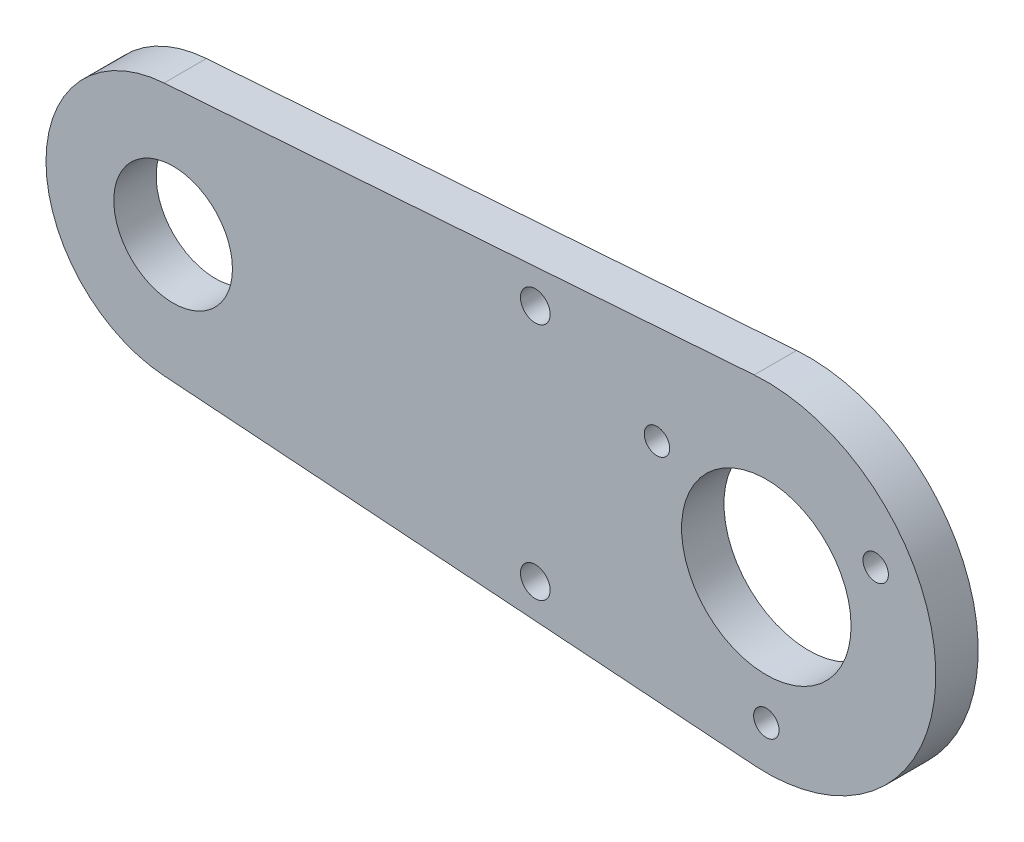
ISO-10303-21;
HEADER;
FILE_DESCRIPTION(('STEP AP214'),'2;1');
FILE_NAME('part.step','',(''),(''),'','','');
FILE_SCHEMA(('AUTOMOTIVE_DESIGN { 1 0 10303 214 1 1 1 1 }'));
ENDSEC;
DATA;
#1=APPLICATION_CONTEXT('core data for automotive mechanical design processes');
#2=APPLICATION_PROTOCOL_DEFINITION('international standard','automotive_design',2000,#1);
#3=PRODUCT_CONTEXT('',#1,'mechanical');
#4=PRODUCT('Part','Part','',(#3));
#5=PRODUCT_RELATED_PRODUCT_CATEGORY('part','',(#4));
#6=PRODUCT_DEFINITION_FORMATION('','',#4);
#7=PRODUCT_DEFINITION_CONTEXT('part definition',#1,'design');
#8=PRODUCT_DEFINITION('design','',#6,#7);
#9=PRODUCT_DEFINITION_SHAPE('','',#8);
#10=(LENGTH_UNIT() NAMED_UNIT(*) SI_UNIT(.MILLI.,.METRE.));
#11=(NAMED_UNIT(*) PLANE_ANGLE_UNIT() SI_UNIT($,.RADIAN.));
#12=(NAMED_UNIT(*) SI_UNIT($,.STERADIAN.) SOLID_ANGLE_UNIT());
#13=UNCERTAINTY_MEASURE_WITH_UNIT(LENGTH_MEASURE(1.E-05),#10,'distance_accuracy_value','');
#14=(GEOMETRIC_REPRESENTATION_CONTEXT(3) GLOBAL_UNCERTAINTY_ASSIGNED_CONTEXT((#13)) GLOBAL_UNIT_ASSIGNED_CONTEXT((#10,
#11,#12)) REPRESENTATION_CONTEXT('',''));
#15=CARTESIAN_POINT('',(0.,0.,0.));
#16=DIRECTION('',(0.,0.,1.));
#17=DIRECTION('',(1.,0.,0.));
#18=AXIS2_PLACEMENT_3D('',#15,#16,#17);
#19=CARTESIAN_POINT('',(0.,0.,5.));
#20=DIRECTION('',(0.,0.,1.));
#21=DIRECTION('',(1.,0.,0.));
#22=AXIS2_PLACEMENT_3D('',#19,#20,#21);
#23=PLANE('',#22);
#24=CARTESIAN_POINT('',(-27.2623215608162,14.0886777814287,5.));
#25=DIRECTION('',(0.,0.,1.));
#26=DIRECTION('',(1.,0.,0.));
#27=AXIS2_PLACEMENT_3D('',#24,#25,#26);
#28=CIRCLE('',#27,1.75);
#29=CARTESIAN_POINT('',(-25.5123215608162,14.0886777814287,5.));
#30=VERTEX_POINT('',#29);
#31=EDGE_CURVE('E141',#30,#30,#28,.T.);
#32=ORIENTED_EDGE('',*,*,#31,.F.);
#33=EDGE_LOOP('',(#32));
#34=FACE_BOUND('',#33,.T.);
#35=CARTESIAN_POINT('',(0.,-14.9000000000001,5.));
#36=DIRECTION('',(0.,0.,1.));
#37=DIRECTION('',(1.,0.,0.));
#38=AXIS2_PLACEMENT_3D('',#35,#36,#37);
#39=CIRCLE('',#38,1.5);
#40=CARTESIAN_POINT('',(1.5,-14.9000000000001,5.));
#41=VERTEX_POINT('',#40);
#42=EDGE_CURVE('E129',#41,#41,#39,.T.);
#43=ORIENTED_EDGE('',*,*,#42,.F.);
#44=EDGE_LOOP('',(#43));
#45=FACE_BOUND('',#44,.T.);
#46=CARTESIAN_POINT('',(-70.,0.,5.));
#47=DIRECTION('',(0.,0.,1.));
#48=DIRECTION('',(1.,0.,0.));
#49=AXIS2_PLACEMENT_3D('',#46,#47,#48);
#50=CIRCLE('',#49,7.);
#51=CARTESIAN_POINT('',(-63.,0.,5.));
#52=VERTEX_POINT('',#51);
#53=EDGE_CURVE('E117',#52,#52,#50,.T.);
#54=ORIENTED_EDGE('',*,*,#53,.F.);
#55=EDGE_LOOP('',(#54));
#56=FACE_BOUND('',#55,.T.);
#57=CARTESIAN_POINT('',(0.,0.,5.));
#58=DIRECTION('',(0.,0.,1.));
#59=DIRECTION('',(1.,0.,0.));
#60=AXIS2_PLACEMENT_3D('',#57,#58,#59);
#61=CIRCLE('',#60,20.);
#62=CARTESIAN_POINT('',(-1.42857142857143,-19.9489143482413,5.));
#63=VERTEX_POINT('',#62);
#64=CARTESIAN_POINT('',(-1.42857142857143,19.9489143482413,5.));
#65=VERTEX_POINT('',#64);
#66=EDGE_CURVE('E87',#63,#65,#61,.T.);
#67=ORIENTED_EDGE('',*,*,#66,.T.);
#68=DIRECTION('',(-0.997445717412067,-0.0714285714285714,0.));
#69=VECTOR('',#68,1.);
#70=CARTESIAN_POINT('',(-71.0714285714286,14.961685761181,5.));
#71=LINE('',#70,#69);
#72=CARTESIAN_POINT('',(-71.0714285714286,14.961685761181,5.));
#73=VERTEX_POINT('',#72);
#74=EDGE_CURVE('E82',#65,#73,#71,.T.);
#75=ORIENTED_EDGE('',*,*,#74,.T.);
#76=CARTESIAN_POINT('',(-70.,0.,5.));
#77=DIRECTION('',(0.,0.,1.));
#78=DIRECTION('',(-1.,0.,0.));
#79=AXIS2_PLACEMENT_3D('',#76,#77,#78);
#80=CIRCLE('',#79,15.);
#81=CARTESIAN_POINT('',(-71.0714285714286,-14.961685761181,5.));
#82=VERTEX_POINT('',#81);
#83=EDGE_CURVE('E85',#73,#82,#80,.T.);
#84=ORIENTED_EDGE('',*,*,#83,.T.);
#85=DIRECTION('',(0.997445717412067,-0.0714285714285714,0.));
#86=VECTOR('',#85,1.);
#87=CARTESIAN_POINT('',(-71.0714285714286,-14.961685761181,5.));
#88=LINE('',#87,#86);
#89=EDGE_CURVE('E52',#82,#63,#88,.T.);
#90=ORIENTED_EDGE('',*,*,#89,.T.);
#91=EDGE_LOOP('',(#67,#75,#84,#90));
#92=FACE_BOUND('',#91,.T.);
#93=CARTESIAN_POINT('',(0.,0.,5.));
#94=DIRECTION('',(0.,0.,1.));
#95=DIRECTION('',(1.,0.,0.));
#96=AXIS2_PLACEMENT_3D('',#93,#94,#95);
#97=CIRCLE('',#96,10.);
#98=CARTESIAN_POINT('',(10.,0.,5.));
#99=VERTEX_POINT('',#98);
#100=EDGE_CURVE('E102',#99,#99,#97,.T.);
#101=ORIENTED_EDGE('',*,*,#100,.F.);
#102=EDGE_LOOP('',(#101));
#103=FACE_BOUND('',#102,.T.);
#104=CARTESIAN_POINT('',(-12.9037785163881,7.45,5.));
#105=DIRECTION('',(0.,0.,1.));
#106=DIRECTION('',(1.,0.,0.));
#107=AXIS2_PLACEMENT_3D('',#104,#105,#106);
#108=CIRCLE('',#107,1.5);
#109=CARTESIAN_POINT('',(-11.4037785163881,7.45,5.));
#110=VERTEX_POINT('',#109);
#111=EDGE_CURVE('E123',#110,#110,#108,.T.);
#112=ORIENTED_EDGE('',*,*,#111,.F.);
#113=EDGE_LOOP('',(#112));
#114=FACE_BOUND('',#113,.T.);
#115=CARTESIAN_POINT('',(12.9037785163882,7.44999999999981,5.));
#116=DIRECTION('',(0.,0.,1.));
#117=DIRECTION('',(1.,0.,0.));
#118=AXIS2_PLACEMENT_3D('',#115,#116,#117);
#119=CIRCLE('',#118,1.5);
#120=CARTESIAN_POINT('',(14.4037785163882,7.44999999999981,5.));
#121=VERTEX_POINT('',#120);
#122=EDGE_CURVE('E135',#121,#121,#119,.T.);
#123=ORIENTED_EDGE('',*,*,#122,.F.);
#124=EDGE_LOOP('',(#123));
#125=FACE_BOUND('',#124,.T.);
#126=CARTESIAN_POINT('',(-27.2623215608162,-14.0886777814287,5.));
#127=DIRECTION('',(0.,0.,1.));
#128=DIRECTION('',(1.,0.,0.));
#129=AXIS2_PLACEMENT_3D('',#126,#127,#128);
#130=CIRCLE('',#129,1.75);
#131=CARTESIAN_POINT('',(-25.5123215608162,-14.0886777814287,5.));
#132=VERTEX_POINT('',#131);
#133=EDGE_CURVE('E147',#132,#132,#130,.T.);
#134=ORIENTED_EDGE('',*,*,#133,.F.);
#135=EDGE_LOOP('',(#134));
#136=FACE_BOUND('',#135,.T.);
#137=ADVANCED_FACE('F35',(#34,#45,#56,#92,#103,#114,#125,#136),#23,.T.);
#138=CARTESIAN_POINT('',(0.,0.,0.));
#139=DIRECTION('',(0.,0.,1.));
#140=DIRECTION('',(1.,0.,0.));
#141=AXIS2_PLACEMENT_3D('',#138,#139,#140);
#142=PLANE('',#141);
#143=CARTESIAN_POINT('',(0.,0.,0.));
#144=DIRECTION('',(0.,0.,1.));
#145=DIRECTION('',(1.,0.,0.));
#146=AXIS2_PLACEMENT_3D('',#143,#144,#145);
#147=CIRCLE('',#146,20.);
#148=CARTESIAN_POINT('',(-1.42857142857143,-19.9489143482413,0.));
#149=VERTEX_POINT('',#148);
#150=CARTESIAN_POINT('',(-1.42857142857143,19.9489143482413,0.));
#151=VERTEX_POINT('',#150);
#152=EDGE_CURVE('E99',#149,#151,#147,.T.);
#153=ORIENTED_EDGE('',*,*,#152,.F.);
#154=DIRECTION('',(0.997445717412067,-0.0714285714285714,0.));
#155=VECTOR('',#154,1.);
#156=CARTESIAN_POINT('',(-71.0714285714286,-14.961685761181,0.));
#157=LINE('',#156,#155);
#158=CARTESIAN_POINT('',(-71.0714285714286,-14.961685761181,0.));
#159=VERTEX_POINT('',#158);
#160=EDGE_CURVE('E75',#159,#149,#157,.T.);
#161=ORIENTED_EDGE('',*,*,#160,.F.);
#162=CARTESIAN_POINT('',(-70.,0.,0.));
#163=DIRECTION('',(0.,0.,1.));
#164=DIRECTION('',(-1.,0.,0.));
#165=AXIS2_PLACEMENT_3D('',#162,#163,#164);
#166=CIRCLE('',#165,15.);
#167=CARTESIAN_POINT('',(-71.0714285714286,14.961685761181,0.));
#168=VERTEX_POINT('',#167);
#169=EDGE_CURVE('E69',#168,#159,#166,.T.);
#170=ORIENTED_EDGE('',*,*,#169,.F.);
#171=DIRECTION('',(-0.997445717412067,-0.0714285714285714,0.));
#172=VECTOR('',#171,1.);
#173=CARTESIAN_POINT('',(-71.0714285714286,14.961685761181,0.));
#174=LINE('',#173,#172);
#175=EDGE_CURVE('E91',#151,#168,#174,.T.);
#176=ORIENTED_EDGE('',*,*,#175,.F.);
#177=EDGE_LOOP('',(#153,#161,#170,#176));
#178=FACE_BOUND('',#177,.T.);
#179=CARTESIAN_POINT('',(0.,0.,0.));
#180=DIRECTION('',(0.,0.,1.));
#181=DIRECTION('',(1.,0.,0.));
#182=AXIS2_PLACEMENT_3D('',#179,#180,#181);
#183=CIRCLE('',#182,10.);
#184=CARTESIAN_POINT('',(10.,0.,0.));
#185=VERTEX_POINT('',#184);
#186=EDGE_CURVE('E114',#185,#185,#183,.T.);
#187=ORIENTED_EDGE('',*,*,#186,.T.);
#188=EDGE_LOOP('',(#187));
#189=FACE_BOUND('',#188,.T.);
#190=CARTESIAN_POINT('',(-70.,0.,0.));
#191=DIRECTION('',(0.,0.,1.));
#192=DIRECTION('',(1.,0.,0.));
#193=AXIS2_PLACEMENT_3D('',#190,#191,#192);
#194=CIRCLE('',#193,7.);
#195=CARTESIAN_POINT('',(-63.,0.,0.));
#196=VERTEX_POINT('',#195);
#197=EDGE_CURVE('E120',#196,#196,#194,.T.);
#198=ORIENTED_EDGE('',*,*,#197,.T.);
#199=EDGE_LOOP('',(#198));
#200=FACE_BOUND('',#199,.T.);
#201=CARTESIAN_POINT('',(-12.9037785163881,7.45,0.));
#202=DIRECTION('',(0.,0.,1.));
#203=DIRECTION('',(1.,0.,0.));
#204=AXIS2_PLACEMENT_3D('',#201,#202,#203);
#205=CIRCLE('',#204,1.5);
#206=CARTESIAN_POINT('',(-11.4037785163881,7.45,0.));
#207=VERTEX_POINT('',#206);
#208=EDGE_CURVE('E126',#207,#207,#205,.T.);
#209=ORIENTED_EDGE('',*,*,#208,.T.);
#210=EDGE_LOOP('',(#209));
#211=FACE_BOUND('',#210,.T.);
#212=CARTESIAN_POINT('',(0.,-14.9000000000001,0.));
#213=DIRECTION('',(0.,0.,1.));
#214=DIRECTION('',(1.,0.,0.));
#215=AXIS2_PLACEMENT_3D('',#212,#213,#214);
#216=CIRCLE('',#215,1.5);
#217=CARTESIAN_POINT('',(1.5,-14.9000000000001,0.));
#218=VERTEX_POINT('',#217);
#219=EDGE_CURVE('E132',#218,#218,#216,.T.);
#220=ORIENTED_EDGE('',*,*,#219,.T.);
#221=EDGE_LOOP('',(#220));
#222=FACE_BOUND('',#221,.T.);
#223=CARTESIAN_POINT('',(12.9037785163882,7.44999999999981,0.));
#224=DIRECTION('',(0.,0.,1.));
#225=DIRECTION('',(1.,0.,0.));
#226=AXIS2_PLACEMENT_3D('',#223,#224,#225);
#227=CIRCLE('',#226,1.5);
#228=CARTESIAN_POINT('',(14.4037785163882,7.44999999999981,0.));
#229=VERTEX_POINT('',#228);
#230=EDGE_CURVE('E138',#229,#229,#227,.T.);
#231=ORIENTED_EDGE('',*,*,#230,.T.);
#232=EDGE_LOOP('',(#231));
#233=FACE_BOUND('',#232,.T.);
#234=CARTESIAN_POINT('',(-27.2623215608162,14.0886777814287,0.));
#235=DIRECTION('',(0.,0.,1.));
#236=DIRECTION('',(1.,0.,0.));
#237=AXIS2_PLACEMENT_3D('',#234,#235,#236);
#238=CIRCLE('',#237,1.75);
#239=CARTESIAN_POINT('',(-25.5123215608162,14.0886777814287,0.));
#240=VERTEX_POINT('',#239);
#241=EDGE_CURVE('E144',#240,#240,#238,.T.);
#242=ORIENTED_EDGE('',*,*,#241,.T.);
#243=EDGE_LOOP('',(#242));
#244=FACE_BOUND('',#243,.T.);
#245=CARTESIAN_POINT('',(-27.2623215608162,-14.0886777814287,0.));
#246=DIRECTION('',(0.,0.,1.));
#247=DIRECTION('',(1.,0.,0.));
#248=AXIS2_PLACEMENT_3D('',#245,#246,#247);
#249=CIRCLE('',#248,1.75);
#250=CARTESIAN_POINT('',(-25.5123215608162,-14.0886777814287,0.));
#251=VERTEX_POINT('',#250);
#252=EDGE_CURVE('E150',#251,#251,#249,.T.);
#253=ORIENTED_EDGE('',*,*,#252,.T.);
#254=EDGE_LOOP('',(#253));
#255=FACE_BOUND('',#254,.T.);
#256=ADVANCED_FACE('F110',(#178,#189,#200,#211,#222,#233,#244,#255),#142,.F.);
#257=CARTESIAN_POINT('',(0.,0.,5.));
#258=DIRECTION('',(0.,0.,-1.));
#259=DIRECTION('',(-1.,0.,0.));
#260=AXIS2_PLACEMENT_3D('',#257,#258,#259);
#261=CYLINDRICAL_SURFACE('',#260,20.);
#262=ORIENTED_EDGE('',*,*,#152,.T.);
#263=DIRECTION('',(0.,0.,-1.));
#264=VECTOR('',#263,1.);
#265=CARTESIAN_POINT('',(-1.42857142857143,19.9489143482413,5.));
#266=LINE('',#265,#264);
#267=EDGE_CURVE('E11',#65,#151,#266,.T.);
#268=ORIENTED_EDGE('',*,*,#267,.F.);
#269=ORIENTED_EDGE('',*,*,#66,.F.);
#270=DIRECTION('',(0.,0.,-1.));
#271=VECTOR('',#270,1.);
#272=CARTESIAN_POINT('',(-1.42857142857143,-19.9489143482413,5.));
#273=LINE('',#272,#271);
#274=EDGE_CURVE('E95',#63,#149,#273,.T.);
#275=ORIENTED_EDGE('',*,*,#274,.T.);
#276=EDGE_LOOP('',(#262,#268,#269,#275));
#277=FACE_BOUND('',#276,.T.);
#278=ADVANCED_FACE('F37',(#277),#261,.T.);
#279=CARTESIAN_POINT('',(-71.0714285714286,14.961685761181,5.));
#280=DIRECTION('',(0.0714285714285714,-0.997445717412067,0.));
#281=DIRECTION('',(0.997445717412067,0.0714285714285714,0.));
#282=AXIS2_PLACEMENT_3D('',#279,#280,#281);
#283=PLANE('',#282);
#284=ORIENTED_EDGE('',*,*,#175,.T.);
#285=DIRECTION('',(0.,0.,-1.));
#286=VECTOR('',#285,1.);
#287=CARTESIAN_POINT('',(-71.0714285714286,14.961685761181,5.));
#288=LINE('',#287,#286);
#289=EDGE_CURVE('E44',#73,#168,#288,.T.);
#290=ORIENTED_EDGE('',*,*,#289,.F.);
#291=ORIENTED_EDGE('',*,*,#74,.F.);
#292=ORIENTED_EDGE('',*,*,#267,.T.);
#293=EDGE_LOOP('',(#284,#290,#291,#292));
#294=FACE_BOUND('',#293,.T.);
#295=ADVANCED_FACE('F90',(#294),#283,.F.);
#296=CARTESIAN_POINT('',(-70.,0.,5.));
#297=DIRECTION('',(0.,0.,-1.));
#298=DIRECTION('',(-1.,0.,0.));
#299=AXIS2_PLACEMENT_3D('',#296,#297,#298);
#300=CYLINDRICAL_SURFACE('',#299,15.);
#301=ORIENTED_EDGE('',*,*,#169,.T.);
#302=DIRECTION('',(0.,0.,-1.));
#303=VECTOR('',#302,1.);
#304=CARTESIAN_POINT('',(-71.0714285714286,-14.961685761181,5.));
#305=LINE('',#304,#303);
#306=EDGE_CURVE('E92',#82,#159,#305,.T.);
#307=ORIENTED_EDGE('',*,*,#306,.F.);
#308=ORIENTED_EDGE('',*,*,#83,.F.);
#309=ORIENTED_EDGE('',*,*,#289,.T.);
#310=EDGE_LOOP('',(#301,#307,#308,#309));
#311=FACE_BOUND('',#310,.T.);
#312=ADVANCED_FACE('F93',(#311),#300,.T.);
#313=CARTESIAN_POINT('',(-71.0714285714286,-14.961685761181,5.));
#314=DIRECTION('',(0.0714285714285714,0.997445717412067,0.));
#315=DIRECTION('',(-0.997445717412067,0.0714285714285714,0.));
#316=AXIS2_PLACEMENT_3D('',#313,#314,#315);
#317=PLANE('',#316);
#318=ORIENTED_EDGE('',*,*,#160,.T.);
#319=ORIENTED_EDGE('',*,*,#274,.F.);
#320=ORIENTED_EDGE('',*,*,#89,.F.);
#321=ORIENTED_EDGE('',*,*,#306,.T.);
#322=EDGE_LOOP('',(#318,#319,#320,#321));
#323=FACE_BOUND('',#322,.T.);
#324=ADVANCED_FACE('F107',(#323),#317,.F.);
#325=CARTESIAN_POINT('',(0.,0.,5.));
#326=DIRECTION('',(0.,0.,-1.));
#327=DIRECTION('',(-1.,0.,0.));
#328=AXIS2_PLACEMENT_3D('',#325,#326,#327);
#329=CYLINDRICAL_SURFACE('',#328,10.);
#330=ORIENTED_EDGE('',*,*,#100,.T.);
#331=EDGE_LOOP('',(#330));
#332=FACE_BOUND('',#331,.T.);
#333=ORIENTED_EDGE('',*,*,#186,.F.);
#334=EDGE_LOOP('',(#333));
#335=FACE_BOUND('',#334,.T.);
#336=ADVANCED_FACE('F169',(#332,#335),#329,.F.);
#337=CARTESIAN_POINT('',(-70.,0.,5.));
#338=DIRECTION('',(0.,0.,-1.));
#339=DIRECTION('',(-1.,0.,0.));
#340=AXIS2_PLACEMENT_3D('',#337,#338,#339);
#341=CYLINDRICAL_SURFACE('',#340,7.);
#342=ORIENTED_EDGE('',*,*,#53,.T.);
#343=EDGE_LOOP('',(#342));
#344=FACE_BOUND('',#343,.T.);
#345=ORIENTED_EDGE('',*,*,#197,.F.);
#346=EDGE_LOOP('',(#345));
#347=FACE_BOUND('',#346,.T.);
#348=ADVANCED_FACE('F215',(#344,#347),#341,.F.);
#349=CARTESIAN_POINT('',(-12.9037785163881,7.45,5.));
#350=DIRECTION('',(0.,0.,-1.));
#351=DIRECTION('',(-1.,0.,0.));
#352=AXIS2_PLACEMENT_3D('',#349,#350,#351);
#353=CYLINDRICAL_SURFACE('',#352,1.5);
#354=ORIENTED_EDGE('',*,*,#111,.T.);
#355=EDGE_LOOP('',(#354));
#356=FACE_BOUND('',#355,.T.);
#357=ORIENTED_EDGE('',*,*,#208,.F.);
#358=EDGE_LOOP('',(#357));
#359=FACE_BOUND('',#358,.T.);
#360=ADVANCED_FACE('F223',(#356,#359),#353,.F.);
#361=CARTESIAN_POINT('',(0.,-14.9000000000001,5.));
#362=DIRECTION('',(0.,0.,-1.));
#363=DIRECTION('',(-1.,0.,0.));
#364=AXIS2_PLACEMENT_3D('',#361,#362,#363);
#365=CYLINDRICAL_SURFACE('',#364,1.5);
#366=ORIENTED_EDGE('',*,*,#42,.T.);
#367=EDGE_LOOP('',(#366));
#368=FACE_BOUND('',#367,.T.);
#369=ORIENTED_EDGE('',*,*,#219,.F.);
#370=EDGE_LOOP('',(#369));
#371=FACE_BOUND('',#370,.T.);
#372=ADVANCED_FACE('F231',(#368,#371),#365,.F.);
#373=CARTESIAN_POINT('',(12.9037785163882,7.44999999999981,5.));
#374=DIRECTION('',(0.,0.,-1.));
#375=DIRECTION('',(-1.,0.,0.));
#376=AXIS2_PLACEMENT_3D('',#373,#374,#375);
#377=CYLINDRICAL_SURFACE('',#376,1.5);
#378=ORIENTED_EDGE('',*,*,#122,.T.);
#379=EDGE_LOOP('',(#378));
#380=FACE_BOUND('',#379,.T.);
#381=ORIENTED_EDGE('',*,*,#230,.F.);
#382=EDGE_LOOP('',(#381));
#383=FACE_BOUND('',#382,.T.);
#384=ADVANCED_FACE('F240',(#380,#383),#377,.F.);
#385=CARTESIAN_POINT('',(-27.2623215608162,14.0886777814287,5.));
#386=DIRECTION('',(0.,0.,-1.));
#387=DIRECTION('',(-1.,0.,0.));
#388=AXIS2_PLACEMENT_3D('',#385,#386,#387);
#389=CYLINDRICAL_SURFACE('',#388,1.75);
#390=ORIENTED_EDGE('',*,*,#31,.T.);
#391=EDGE_LOOP('',(#390));
#392=FACE_BOUND('',#391,.T.);
#393=ORIENTED_EDGE('',*,*,#241,.F.);
#394=EDGE_LOOP('',(#393));
#395=FACE_BOUND('',#394,.T.);
#396=ADVANCED_FACE('F249',(#392,#395),#389,.F.);
#397=CARTESIAN_POINT('',(-27.2623215608162,-14.0886777814287,5.));
#398=DIRECTION('',(0.,0.,-1.));
#399=DIRECTION('',(-1.,0.,0.));
#400=AXIS2_PLACEMENT_3D('',#397,#398,#399);
#401=CYLINDRICAL_SURFACE('',#400,1.75);
#402=ORIENTED_EDGE('',*,*,#133,.T.);
#403=EDGE_LOOP('',(#402));
#404=FACE_BOUND('',#403,.T.);
#405=ORIENTED_EDGE('',*,*,#252,.F.);
#406=EDGE_LOOP('',(#405));
#407=FACE_BOUND('',#406,.T.);
#408=ADVANCED_FACE('F156',(#404,#407),#401,.F.);
#409=CLOSED_SHELL('',(#137,#256,#278,#295,#312,#324,#336,#348,#360,#372,#384,#396,#408));
#410=MANIFOLD_SOLID_BREP('B2',#409);
#411=ADVANCED_BREP_SHAPE_REPRESENTATION('',(#18,#410),#14);
#412=SHAPE_DEFINITION_REPRESENTATION(#9,#411);
ENDSEC;
END-ISO-10303-21;
